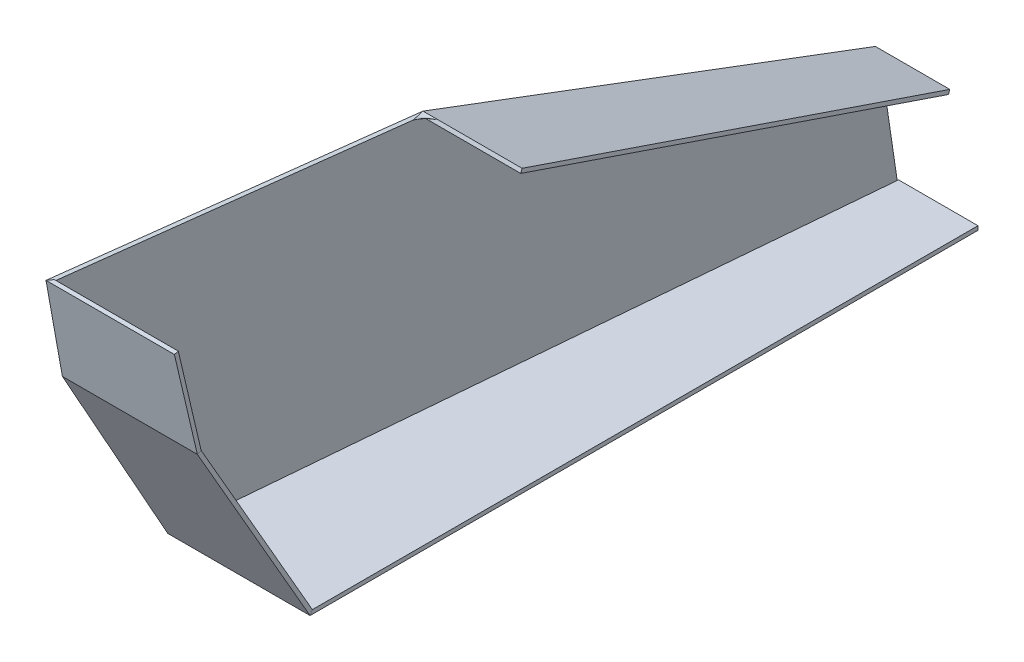
ISO-10303-21;
HEADER;
FILE_DESCRIPTION(('STEP AP214'),'2;1');
FILE_NAME('part.step','',(''),(''),'','','');
FILE_SCHEMA(('AUTOMOTIVE_DESIGN { 1 0 10303 214 1 1 1 1 }'));
ENDSEC;
DATA;
#1=APPLICATION_CONTEXT('core data for automotive mechanical design processes');
#2=APPLICATION_PROTOCOL_DEFINITION('international standard','automotive_design',2000,#1);
#3=PRODUCT_CONTEXT('',#1,'mechanical');
#4=PRODUCT('Part','Part','',(#3));
#5=PRODUCT_RELATED_PRODUCT_CATEGORY('part','',(#4));
#6=PRODUCT_DEFINITION_FORMATION('','',#4);
#7=PRODUCT_DEFINITION_CONTEXT('part definition',#1,'design');
#8=PRODUCT_DEFINITION('design','',#6,#7);
#9=PRODUCT_DEFINITION_SHAPE('','',#8);
#10=(LENGTH_UNIT() NAMED_UNIT(*) SI_UNIT(.MILLI.,.METRE.));
#11=(NAMED_UNIT(*) PLANE_ANGLE_UNIT() SI_UNIT($,.RADIAN.));
#12=(NAMED_UNIT(*) SI_UNIT($,.STERADIAN.) SOLID_ANGLE_UNIT());
#13=UNCERTAINTY_MEASURE_WITH_UNIT(LENGTH_MEASURE(1.E-05),#10,'distance_accuracy_value','');
#14=(GEOMETRIC_REPRESENTATION_CONTEXT(3) GLOBAL_UNCERTAINTY_ASSIGNED_CONTEXT((#13)) GLOBAL_UNIT_ASSIGNED_CONTEXT((#10,
#11,#12)) REPRESENTATION_CONTEXT('',''));
#15=CARTESIAN_POINT('',(0.,0.,0.));
#16=DIRECTION('',(0.,0.,1.));
#17=DIRECTION('',(1.,0.,0.));
#18=AXIS2_PLACEMENT_3D('',#15,#16,#17);
#19=CARTESIAN_POINT('',(0.,110.310015798724,40.4378275892309));
#20=DIRECTION('',(0.,0.946709580585224,-0.322088450628316));
#21=DIRECTION('',(0.,-0.322088450628316,-0.946709580585224));
#22=AXIS2_PLACEMENT_3D('',#19,#20,#21);
#23=PLANE('',#22);
#24=DIRECTION('',(-0.0545658529524883,0.321608594898021,0.945299148089793));
#25=VECTOR('',#24,1.);
#26=CARTESIAN_POINT('',(24.5252101587905,1.78945060946269,-278.534984241748));
#27=LINE('',#26,#25);
#28=CARTESIAN_POINT('',(24.5252101587905,1.78945060946267,-278.534984241748));
#29=VERTEX_POINT('',#28);
#30=CARTESIAN_POINT('',(6.11302436407989,110.310015798724,40.4378275892309));
#31=VERTEX_POINT('',#30);
#32=EDGE_CURVE('E134',#29,#31,#27,.T.);
#33=ORIENTED_EDGE('',*,*,#32,.T.);
#34=DIRECTION('',(1.,0.,0.));
#35=VECTOR('',#34,1.);
#36=CARTESIAN_POINT('',(11.7446754594523,110.310015798724,40.4378275892309));
#37=LINE('',#36,#35);
#38=CARTESIAN_POINT('',(17.3763265548247,110.310015798724,40.4378275892309));
#39=VERTEX_POINT('',#38);
#40=EDGE_CURVE('E113',#31,#39,#37,.T.);
#41=ORIENTED_EDGE('',*,*,#40,.T.);
#42=DIRECTION('',(1.,0.,0.));
#43=VECTOR('',#42,1.);
#44=CARTESIAN_POINT('',(48.6881632774124,110.310015798724,40.4378275892309));
#45=LINE('',#44,#43);
#46=CARTESIAN_POINT('',(80.,110.310015798724,40.4378275892308));
#47=VERTEX_POINT('',#46);
#48=EDGE_CURVE('E121',#39,#47,#45,.T.);
#49=ORIENTED_EDGE('',*,*,#48,.T.);
#50=DIRECTION('',(0.,-0.322088450628316,-0.946709580585224));
#51=VECTOR('',#50,1.);
#52=CARTESIAN_POINT('',(80.,56.0497332040935,-119.048578326258));
#53=LINE('',#52,#51);
#54=CARTESIAN_POINT('',(80.,1.78945060946263,-278.534984241748));
#55=VERTEX_POINT('',#54);
#56=EDGE_CURVE('E130',#47,#55,#53,.T.);
#57=ORIENTED_EDGE('',*,*,#56,.T.);
#58=DIRECTION('',(-1.,0.,0.));
#59=VECTOR('',#58,1.);
#60=CARTESIAN_POINT('',(52.2626050793952,1.78945060946263,-278.534984241748));
#61=LINE('',#60,#59);
#62=EDGE_CURVE('E259',#55,#29,#61,.T.);
#63=ORIENTED_EDGE('',*,*,#62,.T.);
#64=EDGE_LOOP('',(#33,#41,#49,#57,#63));
#65=FACE_BOUND('',#64,.T.);
#66=ADVANCED_FACE('F37',(#65),#23,.T.);
#67=CARTESIAN_POINT('',(0.,-99.7780619293242,-299.564386351645));
#68=DIRECTION('',(0.,-0.999999864234865,0.00052108564756985));
#69=DIRECTION('',(0.,0.00052108564756985,0.999999864234865));
#70=AXIS2_PLACEMENT_3D('',#67,#68,#69);
#71=PLANE('',#70);
#72=DIRECTION('',(0.087110660113036,-0.000519104814101098,-0.996198506034246));
#73=VECTOR('',#72,1.);
#74=CARTESIAN_POINT('',(-4.29862651379476,-99.6482857257989,-50.5147598430838));
#75=LINE('',#74,#73);
#76=CARTESIAN_POINT('',(-26.0762915420538,-99.5185095222735,198.534866665478));
#77=VERTEX_POINT('',#76);
#78=CARTESIAN_POINT('',(17.4790385144642,-99.7780619293242,-299.564386351645));
#79=VERTEX_POINT('',#78);
#80=EDGE_CURVE('E274',#77,#79,#75,.T.);
#81=ORIENTED_EDGE('',*,*,#80,.T.);
#82=DIRECTION('',(1.,0.,0.));
#83=VECTOR('',#82,1.);
#84=CARTESIAN_POINT('',(17.9677659140272,-99.7780619293242,-299.564386351645));
#85=LINE('',#84,#83);
#86=CARTESIAN_POINT('',(18.4564933135901,-99.7780619293242,-299.564386351645));
#87=VERTEX_POINT('',#86);
#88=EDGE_CURVE('E230',#79,#87,#85,.T.);
#89=ORIENTED_EDGE('',*,*,#88,.T.);
#90=DIRECTION('',(1.,0.,0.));
#91=VECTOR('',#90,1.);
#92=CARTESIAN_POINT('',(49.2282466567951,-99.7780619293242,-299.564386351645));
#93=LINE('',#92,#91);
#94=CARTESIAN_POINT('',(80.,-99.7780619293242,-299.564386351645));
#95=VERTEX_POINT('',#94);
#96=EDGE_CURVE('E220',#87,#95,#93,.T.);
#97=ORIENTED_EDGE('',*,*,#96,.T.);
#98=DIRECTION('',(0.,0.000521085647569877,0.999999864234865));
#99=VECTOR('',#98,1.);
#100=CARTESIAN_POINT('',(80.,-99.6482857257989,-50.5147598430839));
#101=LINE('',#100,#99);
#102=CARTESIAN_POINT('',(80.,-99.5185095222736,198.534866665478));
#103=VERTEX_POINT('',#102);
#104=EDGE_CURVE('E210',#95,#103,#101,.T.);
#105=ORIENTED_EDGE('',*,*,#104,.T.);
#106=DIRECTION('',(-1.,0.,0.));
#107=VECTOR('',#106,1.);
#108=CARTESIAN_POINT('',(40.,-99.5185095222735,198.534866665478));
#109=LINE('',#108,#107);
#110=EDGE_CURVE('E277',#103,#77,#109,.T.);
#111=ORIENTED_EDGE('',*,*,#110,.T.);
#112=EDGE_LOOP('',(#81,#89,#97,#105,#111));
#113=FACE_BOUND('',#112,.T.);
#114=ADVANCED_FACE('F308',(#113),#71,.T.);
#115=CARTESIAN_POINT('',(0.,0.,0.));
#116=DIRECTION('',(0.992432509138968,-0.0868265938642405,0.086826593864241));
#117=DIRECTION('',(-0.0871557427476515,0.,0.996194698091746));
#118=AXIS2_PLACEMENT_3D('',#115,#116,#117);
#119=PLANE('',#118);
#120=DIRECTION('',(0.0839663559491868,-0.0360755085509896,-0.995815348722544));
#121=VECTOR('',#120,1.);
#122=CARTESIAN_POINT('',(-4.76922205797275,114.985490510171,169.497948076286));
#123=LINE('',#122,#121);
#124=CARTESIAN_POINT('',(-15.6514684800254,119.660965221617,298.558068563341));
#125=VERTEX_POINT('',#124);
#126=EDGE_CURVE('E136',#125,#31,#123,.T.);
#127=ORIENTED_EDGE('',*,*,#126,.T.);
#128=ORIENTED_EDGE('',*,*,#32,.F.);
#129=DIRECTION('',(-0.0677772099004537,-0.97697912623965,-0.202282072142146));
#130=VECTOR('',#129,1.);
#131=CARTESIAN_POINT('',(24.4749597784683,1.06511314068204,-278.684957235213));
#132=LINE('',#131,#130);
#133=CARTESIAN_POINT('',(24.4247093981462,0.340775671901398,-278.834930228678));
#134=VERTEX_POINT('',#133);
#135=EDGE_CURVE('E250',#29,#134,#132,.T.);
#136=ORIENTED_EDGE('',*,*,#135,.T.);
#137=DIRECTION('',(-0.0677772099004547,-0.976979126239648,-0.202282072142153));
#138=VECTOR('',#137,1.);
#139=CARTESIAN_POINT('',(20.9518739563052,-49.7186431287114,-289.199658290162));
#140=LINE('',#139,#138);
#141=EDGE_CURVE('E240',#134,#79,#140,.T.);
#142=ORIENTED_EDGE('',*,*,#141,.T.);
#143=ORIENTED_EDGE('',*,*,#80,.F.);
#144=DIRECTION('',(-0.0322106718301427,-0.866429327691845,-0.498259663966198));
#145=VECTOR('',#144,1.);
#146=CARTESIAN_POINT('',(-26.0492366756166,-98.7907653180672,198.953372331262));
#147=LINE('',#146,#145);
#148=CARTESIAN_POINT('',(-20.6427459229518,46.6375005903725,282.585166162343));
#149=VERTEX_POINT('',#148);
#150=EDGE_CURVE('E137',#149,#77,#147,.T.);
#151=ORIENTED_EDGE('',*,*,#150,.F.);
#152=DIRECTION('',(-0.0650839922381132,-0.971565120847082,-0.227651685492871));
#153=VECTOR('',#152,1.);
#154=CARTESIAN_POINT('',(-20.555304777843,47.9428102954658,282.891019005429));
#155=LINE('',#154,#153);
#156=CARTESIAN_POINT('',(-15.7482066105749,119.702528026343,299.70535325992));
#157=VERTEX_POINT('',#156);
#158=EDGE_CURVE('E146',#157,#149,#155,.T.);
#159=ORIENTED_EDGE('',*,*,#158,.F.);
#160=DIRECTION('',(0.0839663559491908,-0.0360755085509986,-0.995815348722543));
#161=VECTOR('',#160,1.);
#162=CARTESIAN_POINT('',(-15.6998375453002,119.68174662398,299.13171091163));
#163=LINE('',#162,#161);
#164=EDGE_CURVE('E144',#157,#125,#163,.T.);
#165=ORIENTED_EDGE('',*,*,#164,.T.);
#166=EDGE_LOOP('',(#127,#128,#136,#142,#143,#151,#159,#165));
#167=FACE_BOUND('',#166,.T.);
#168=ADVANCED_FACE('F303',(#167),#119,.F.);
#169=CARTESIAN_POINT('',(0.,-99.5185095222735,198.534866665478));
#170=DIRECTION('',(0.,-0.49851834429635,0.866879149824257));
#171=DIRECTION('',(0.,0.866879149824257,0.49851834429635));
#172=AXIS2_PLACEMENT_3D('',#169,#170,#171);
#173=PLANE('',#172);
#174=ORIENTED_EDGE('',*,*,#150,.T.);
#175=ORIENTED_EDGE('',*,*,#110,.F.);
#176=DIRECTION('',(0.,0.866879149824257,0.498518344296349));
#177=VECTOR('',#176,1.);
#178=CARTESIAN_POINT('',(80.,-26.4405044659506,240.56001641391));
#179=LINE('',#178,#177);
#180=CARTESIAN_POINT('',(80.,46.6375005903725,282.585166162343));
#181=VERTEX_POINT('',#180);
#182=EDGE_CURVE('E200',#103,#181,#179,.T.);
#183=ORIENTED_EDGE('',*,*,#182,.T.);
#184=DIRECTION('',(-1.,0.,0.));
#185=VECTOR('',#184,1.);
#186=CARTESIAN_POINT('',(40.,46.6375005903725,282.585166162343));
#187=LINE('',#186,#185);
#188=EDGE_CURVE('E286',#181,#149,#187,.T.);
#189=ORIENTED_EDGE('',*,*,#188,.T.);
#190=EDGE_LOOP('',(#174,#175,#183,#189));
#191=FACE_BOUND('',#190,.T.);
#192=ADVANCED_FACE('F306',(#191),#173,.T.);
#193=CARTESIAN_POINT('',(0.,46.6375005903725,282.585166162343));
#194=DIRECTION('',(0.,-0.228135380560819,0.973629420332177));
#195=DIRECTION('',(0.,0.973629420332177,0.228135380560819));
#196=AXIS2_PLACEMENT_3D('',#193,#194,#195);
#197=PLANE('',#196);
#198=ORIENTED_EDGE('',*,*,#158,.T.);
#199=ORIENTED_EDGE('',*,*,#188,.F.);
#200=DIRECTION('',(0.,0.973629420332176,0.22813538056082));
#201=VECTOR('',#200,1.);
#202=CARTESIAN_POINT('',(80.,83.1700143083578,291.145259711131));
#203=LINE('',#202,#201);
#204=CARTESIAN_POINT('',(80.,119.702528026343,299.70535325992));
#205=VERTEX_POINT('',#204);
#206=EDGE_CURVE('E190',#181,#205,#203,.T.);
#207=ORIENTED_EDGE('',*,*,#206,.T.);
#208=DIRECTION('',(-1.,0.,0.));
#209=VECTOR('',#208,1.);
#210=CARTESIAN_POINT('',(32.1258966947125,119.702528026343,299.70535325992));
#211=LINE('',#210,#209);
#212=EDGE_CURVE('E180',#205,#157,#211,.T.);
#213=ORIENTED_EDGE('',*,*,#212,.T.);
#214=EDGE_LOOP('',(#198,#199,#207,#213));
#215=FACE_BOUND('',#214,.T.);
#216=ADVANCED_FACE('F299',(#215),#197,.T.);
#217=CARTESIAN_POINT('',(8.30819276683167,110.385571868704,49.9741200248322));
#218=CARTESIAN_POINT('',(6.11302436407989,110.310015798724,40.4378275892309));
#219=CARTESIAN_POINT('',(8.80288361532537,107.469887056969,41.4040929411158));
#220=CARTESIAN_POINT('',(17.3763265548247,110.310015798724,40.4378275892309));
#221=B_SPLINE_SURFACE_WITH_KNOTS('',1,1,((#217,#218),(#219,#220)),.UNSPECIFIED.,.F.,.F.,.F.,(2,
2),(2,2),(0.,1.),(0.,1.),.UNSPECIFIED.);
#222=DIRECTION('',(-0.0545658529524883,0.321608594898021,0.945299148089793));
#223=VECTOR('',#222,1.);
#224=CARTESIAN_POINT('',(8.77667362524173,107.624367517311,41.8581549589694));
#225=LINE('',#224,#223);
#226=CARTESIAN_POINT('',(8.80288361532537,107.469887056969,41.4040929411158));
#227=VERTEX_POINT('',#226);
#228=CARTESIAN_POINT('',(8.30819276683167,110.385571868704,49.9741200248322));
#229=VERTEX_POINT('',#228);
#230=EDGE_CURVE('E117',#227,#229,#225,.T.);
#231=DIRECTION('',(0.943882555833576,0.312680447584724,-0.10637978422282));
#232=VECTOR('',#231,1.);
#233=CARTESIAN_POINT('',(13.089605085075,108.889951427847,40.9209602651733));
#234=LINE('',#233,#232);
#235=EDGE_CURVE('E108',#227,#39,#234,.T.);
#236=DIRECTION('',(-0.224317755475283,-0.00772085094208945,-0.97448547092261));
#237=VECTOR('',#236,1.);
#238=CARTESIAN_POINT('',(7.21060856545578,110.347793833714,45.2059738070315));
#239=LINE('',#238,#237);
#240=EDGE_CURVE('E120',#229,#31,#239,.T.);
#241=ORIENTED_EDGE('',*,*,#230,.F.);
#242=ORIENTED_EDGE('',*,*,#235,.T.);
#243=ORIENTED_EDGE('',*,*,#40,.F.);
#244=ORIENTED_EDGE('',*,*,#240,.F.);
#245=EDGE_LOOP('',(#241,#242,#243,#244));
#246=FACE_BOUND('',#245,.T.);
#247=ADVANCED_FACE('F110',(#246),#221,.T.);
#248=CARTESIAN_POINT('',(-12.4815339952419,119.317720431062,296.533932837826));
#249=DIRECTION('',(-0.0895955683767089,-0.995570037858072,0.0285119947834629));
#250=DIRECTION('',(0.0839663559491868,-0.0360755085509896,-0.995815348722544));
#251=AXIS2_PLACEMENT_3D('',#248,#249,#250);
#252=PLANE('',#251);
#253=DIRECTION('',(-0.0839663559491868,0.0360755085509896,0.995815348722544));
#254=VECTOR('',#253,1.);
#255=CARTESIAN_POINT('',(9.09032189149679,110.049536017132,40.6983073708237));
#256=LINE('',#255,#254);
#257=CARTESIAN_POINT('',(-12.4815339952419,119.317720431062,296.533932837826));
#258=VERTEX_POINT('',#257);
#259=EDGE_CURVE('E387',#229,#258,#256,.T.);
#260=ORIENTED_EDGE('',*,*,#259,.F.);
#261=ORIENTED_EDGE('',*,*,#240,.T.);
#262=ORIENTED_EDGE('',*,*,#126,.F.);
#263=DIRECTION('',(-0.839340817729522,0.0908849582126281,0.535954210790275));
#264=VECTOR('',#263,1.);
#265=CARTESIAN_POINT('',(-14.0665012376337,119.48934282634,297.546000700584));
#266=LINE('',#265,#264);
#267=EDGE_CURVE('E156',#258,#125,#266,.T.);
#268=ORIENTED_EDGE('',*,*,#267,.F.);
#269=EDGE_LOOP('',(#260,#261,#262,#268));
#270=FACE_BOUND('',#269,.T.);
#271=ADVANCED_FACE('F466',(#270),#252,.F.);
#272=CARTESIAN_POINT('',(-12.409908638316,120.386934168026,296.784464998923));
#273=CARTESIAN_POINT('',(-15.7482066105749,119.702528026343,299.70535325992));
#274=CARTESIAN_POINT('',(-12.4815339952419,119.317720431062,296.533932837826));
#275=CARTESIAN_POINT('',(-15.6514684800254,119.660965221617,298.558068563341));
#276=B_SPLINE_SURFACE_WITH_KNOTS('',1,1,((#272,#273),(#274,#275)),.UNSPECIFIED.,.F.,.F.,.F.,(2,
2),(2,2),(0.,1.),(0.,1.),.UNSPECIFIED.);
#277=DIRECTION('',(-0.0650839922381132,-0.971565120847082,-0.227651685492871));
#278=VECTOR('',#277,1.);
#279=CARTESIAN_POINT('',(-17.231147588913,48.4161247171829,279.920668917518));
#280=LINE('',#279,#278);
#281=CARTESIAN_POINT('',(-12.409908638316,120.386934168025,296.784464998923));
#282=VERTEX_POINT('',#281);
#283=EDGE_CURVE('E346',#282,#258,#280,.T.);
#284=DIRECTION('',(-0.743788958182735,-0.152489003476044,0.650788052674851));
#285=VECTOR('',#284,1.);
#286=CARTESIAN_POINT('',(-14.0790576244455,120.044731097184,298.244909129421));
#287=LINE('',#286,#285);
#288=EDGE_CURVE('E163',#282,#157,#287,.T.);
#289=ORIENTED_EDGE('',*,*,#283,.T.);
#290=ORIENTED_EDGE('',*,*,#267,.T.);
#291=ORIENTED_EDGE('',*,*,#164,.F.);
#292=ORIENTED_EDGE('',*,*,#288,.F.);
#293=EDGE_LOOP('',(#289,#290,#291,#292));
#294=FACE_BOUND('',#293,.T.);
#295=ADVANCED_FACE('F344',(#294),#276,.T.);
#296=CARTESIAN_POINT('',(80.,120.386934168025,296.784464998923));
#297=DIRECTION('',(0.,-0.973629420332177,-0.228135380560816));
#298=DIRECTION('',(-1.,0.,0.));
#299=AXIS2_PLACEMENT_3D('',#296,#297,#298);
#300=PLANE('',#299);
#301=DIRECTION('',(1.,0.,0.));
#302=VECTOR('',#301,1.);
#303=CARTESIAN_POINT('',(0.,120.386934168025,296.784464998923));
#304=LINE('',#303,#302);
#305=CARTESIAN_POINT('',(80.,120.386934168025,296.784464998923));
#306=VERTEX_POINT('',#305);
#307=EDGE_CURVE('E342',#282,#306,#304,.T.);
#308=ORIENTED_EDGE('',*,*,#307,.F.);
#309=ORIENTED_EDGE('',*,*,#288,.T.);
#310=ORIENTED_EDGE('',*,*,#212,.F.);
#311=DIRECTION('',(0.,-0.228135380560816,0.973629420332177));
#312=VECTOR('',#311,1.);
#313=CARTESIAN_POINT('',(80.,120.044731097184,298.244909129421));
#314=LINE('',#313,#312);
#315=EDGE_CURVE('E169',#306,#205,#314,.T.);
#316=ORIENTED_EDGE('',*,*,#315,.F.);
#317=EDGE_LOOP('',(#308,#309,#310,#316));
#318=FACE_BOUND('',#317,.T.);
#319=ADVANCED_FACE('F339',(#318),#300,.F.);
#320=CARTESIAN_POINT('',(80.,47.7510046659383,279.764821720586));
#321=DIRECTION('',(-1.,0.,0.));
#322=DIRECTION('',(0.,0.973629420332177,0.228135380560819));
#323=AXIS2_PLACEMENT_3D('',#320,#321,#322);
#324=PLANE('',#323);
#325=DIRECTION('',(0.,0.973629420332177,0.228135380560819));
#326=VECTOR('',#325,1.);
#327=CARTESIAN_POINT('',(80.,47.321906732055,279.664277901347));
#328=LINE('',#327,#326);
#329=CARTESIAN_POINT('',(80.,47.7510046659383,279.764821720586));
#330=VERTEX_POINT('',#329);
#331=EDGE_CURVE('E335',#306,#330,#328,.F.);
#332=ORIENTED_EDGE('',*,*,#331,.F.);
#333=ORIENTED_EDGE('',*,*,#315,.T.);
#334=ORIENTED_EDGE('',*,*,#206,.F.);
#335=DIRECTION('',(0.,-0.367226515962012,0.930131542296251));
#336=VECTOR('',#335,1.);
#337=CARTESIAN_POINT('',(80.,47.1942526281554,281.174993941465));
#338=LINE('',#337,#336);
#339=EDGE_CURVE('E184',#330,#181,#338,.T.);
#340=ORIENTED_EDGE('',*,*,#339,.F.);
#341=EDGE_LOOP('',(#332,#333,#334,#340));
#342=FACE_BOUND('',#341,.T.);
#343=ADVANCED_FACE('F332',(#342),#324,.F.);
#344=CARTESIAN_POINT('',(80.,-96.5194137158899,196.798874140429));
#345=DIRECTION('',(-1.,0.,0.));
#346=DIRECTION('',(0.,0.866879149824257,0.49851834429635));
#347=AXIS2_PLACEMENT_3D('',#344,#345,#346);
#348=PLANE('',#347);
#349=DIRECTION('',(0.,0.866879149824257,0.49851834429635));
#350=VECTOR('',#349,1.);
#351=CARTESIAN_POINT('',(80.,-98.0229544893845,195.934229216005));
#352=LINE('',#351,#350);
#353=CARTESIAN_POINT('',(80.,-96.51941371589,196.798874140429));
#354=VERTEX_POINT('',#353);
#355=EDGE_CURVE('E328',#330,#354,#352,.F.);
#356=ORIENTED_EDGE('',*,*,#355,.F.);
#357=ORIENTED_EDGE('',*,*,#339,.T.);
#358=ORIENTED_EDGE('',*,*,#182,.F.);
#359=DIRECTION('',(0.,-0.865467087280574,0.500965788087451));
#360=VECTOR('',#359,1.);
#361=CARTESIAN_POINT('',(80.,-98.0189616190818,197.666870402953));
#362=LINE('',#361,#360);
#363=EDGE_CURVE('E194',#354,#103,#362,.T.);
#364=ORIENTED_EDGE('',*,*,#363,.F.);
#365=EDGE_LOOP('',(#356,#357,#358,#364));
#366=FACE_BOUND('',#365,.T.);
#367=ADVANCED_FACE('F324',(#366),#348,.F.);
#368=CARTESIAN_POINT('',(80.,-96.7780623366196,-299.565949608588));
#369=DIRECTION('',(-1.,0.,0.));
#370=DIRECTION('',(0.,0.00052108564756986,0.999999864234865));
#371=AXIS2_PLACEMENT_3D('',#368,#369,#370);
#372=PLANE('',#371);
#373=DIRECTION('',(0.,0.00052108564756985,0.999999864234865));
#374=VECTOR('',#373,1.);
#375=CARTESIAN_POINT('',(80.,-96.7780623366196,-299.565949608588));
#376=LINE('',#375,#374);
#377=CARTESIAN_POINT('',(80.,-96.7780623366196,-299.565949608588));
#378=VERTEX_POINT('',#377);
#379=EDGE_CURVE('E320',#354,#378,#376,.F.);
#380=ORIENTED_EDGE('',*,*,#379,.F.);
#381=ORIENTED_EDGE('',*,*,#363,.T.);
#382=ORIENTED_EDGE('',*,*,#104,.F.);
#383=DIRECTION('',(0.,-0.999999864234865,0.000521085647575689));
#384=VECTOR('',#383,1.);
#385=CARTESIAN_POINT('',(80.,-98.2780621329719,-299.565167980117));
#386=LINE('',#385,#384);
#387=EDGE_CURVE('E204',#378,#95,#386,.T.);
#388=ORIENTED_EDGE('',*,*,#387,.F.);
#389=EDGE_LOOP('',(#380,#381,#382,#388));
#390=FACE_BOUND('',#389,.T.);
#391=ADVANCED_FACE('F314',(#390),#372,.F.);
#392=CARTESIAN_POINT('',(20.76451682002,-96.7780623366196,-299.565949608588));
#393=DIRECTION('',(0.,0.000521085647575692,0.999999864234865));
#394=DIRECTION('',(1.,0.,0.));
#395=AXIS2_PLACEMENT_3D('',#392,#393,#394);
#396=PLANE('',#395);
#397=DIRECTION('',(1.,0.,0.));
#398=VECTOR('',#397,1.);
#399=CARTESIAN_POINT('',(0.,-96.7780623366196,-299.565949608588));
#400=LINE('',#399,#398);
#401=CARTESIAN_POINT('',(20.76451682002,-96.7780623366196,-299.565949608588));
#402=VERTEX_POINT('',#401);
#403=EDGE_CURVE('E393',#378,#402,#400,.F.);
#404=ORIENTED_EDGE('',*,*,#403,.F.);
#405=ORIENTED_EDGE('',*,*,#387,.T.);
#406=ORIENTED_EDGE('',*,*,#96,.F.);
#407=DIRECTION('',(-0.609765731933374,-0.792581593016341,0.000413002948724894));
#408=VECTOR('',#407,1.);
#409=CARTESIAN_POINT('',(19.610505066805,-98.2780621329719,-299.565167980117));
#410=LINE('',#409,#408);
#411=EDGE_CURVE('E214',#402,#87,#410,.T.);
#412=ORIENTED_EDGE('',*,*,#411,.F.);
#413=EDGE_LOOP('',(#404,#405,#406,#412));
#414=FACE_BOUND('',#413,.T.);
#415=ADVANCED_FACE('F585',(#414),#396,.F.);
#416=CARTESIAN_POINT('',(20.6825632861847,-96.7775739638545,-298.628728057689));
#417=CARTESIAN_POINT('',(17.4790385144642,-99.7780619293242,-299.564386351645));
#418=CARTESIAN_POINT('',(20.76451682002,-96.7780623366196,-299.565949608588));
#419=CARTESIAN_POINT('',(18.4564933135901,-99.7780619293242,-299.564386351645));
#420=B_SPLINE_SURFACE_WITH_KNOTS('',1,1,((#416,#417),(#418,#419)),.UNSPECIFIED.,.F.,.F.,.F.,(2,
2),(2,2),(0.,1.),(0.,1.),.UNSPECIFIED.);
#421=DIRECTION('',(0.087110660113036,-0.000519104814101307,-0.996198506034246));
#422=VECTOR('',#421,1.);
#423=CARTESIAN_POINT('',(20.6069501200766,-96.7771233742426,-297.764015024684));
#424=LINE('',#423,#422);
#425=CARTESIAN_POINT('',(20.6825632861847,-96.7775739638545,-298.628728057689));
#426=VERTEX_POINT('',#425);
#427=EDGE_CURVE('E11',#426,#402,#424,.T.);
#428=DIRECTION('',(-0.713818915757634,-0.668577650830887,-0.208486163368335));
#429=VECTOR('',#428,1.);
#430=CARTESIAN_POINT('',(19.0808009003245,-98.2778179465894,-299.096557204667));
#431=LINE('',#430,#429);
#432=EDGE_CURVE('E224',#426,#79,#431,.T.);
#433=ORIENTED_EDGE('',*,*,#427,.T.);
#434=ORIENTED_EDGE('',*,*,#411,.T.);
#435=ORIENTED_EDGE('',*,*,#88,.F.);
#436=ORIENTED_EDGE('',*,*,#432,.F.);
#437=EDGE_LOOP('',(#433,#434,#435,#436));
#438=FACE_BOUND('',#437,.T.);
#439=ADVANCED_FACE('F594',(#438),#420,.T.);
#440=CARTESIAN_POINT('',(27.2920641529913,-1.50448155983134,-278.902576256418));
#441=DIRECTION('',(-0.102391233131742,-0.194866440132589,0.97547070990769));
#442=DIRECTION('',(-0.0677772099004546,-0.976979126239648,-0.202282072142153));
#443=AXIS2_PLACEMENT_3D('',#440,#441,#442);
#444=PLANE('',#443);
#445=DIRECTION('',(0.0677772099004547,0.976979126239648,0.202282072142153));
#446=VECTOR('',#445,1.);
#447=CARTESIAN_POINT('',(25.0643002533384,-33.616733323333,-285.551370128682));
#448=LINE('',#447,#446);
#449=CARTESIAN_POINT('',(27.2920641529913,-1.50448155983133,-278.902576256418));
#450=VERTEX_POINT('',#449);
#451=EDGE_CURVE('E394',#426,#450,#448,.T.);
#452=ORIENTED_EDGE('',*,*,#451,.F.);
#453=ORIENTED_EDGE('',*,*,#432,.T.);
#454=ORIENTED_EDGE('',*,*,#141,.F.);
#455=DIRECTION('',(-0.84075177638882,0.541057325694415,0.0198348383268284));
#456=VECTOR('',#455,1.);
#457=CARTESIAN_POINT('',(25.8583867755687,-0.581852943964969,-278.868753242548));
#458=LINE('',#457,#456);
#459=EDGE_CURVE('E234',#450,#134,#458,.T.);
#460=ORIENTED_EDGE('',*,*,#459,.F.);
#461=EDGE_LOOP('',(#452,#453,#454,#460));
#462=FACE_BOUND('',#461,.T.);
#463=ADVANCED_FACE('F604',(#462),#444,.F.);
#464=CARTESIAN_POINT('',(27.215069410036,-1.05067813229309,-277.568718889863));
#465=CARTESIAN_POINT('',(24.5252101587905,1.78945060946269,-278.534984241748));
#466=CARTESIAN_POINT('',(27.2920641529913,-1.50448155983134,-278.902576256418));
#467=CARTESIAN_POINT('',(24.4247093981462,0.340775671901397,-278.834930228678));
#468=B_SPLINE_SURFACE_WITH_KNOTS('',1,1,((#464,#465),(#466,#467)),.UNSPECIFIED.,.F.,.F.,.F.,(2,
2),(2,2),(0.,1.),(0.,1.),.UNSPECIFIED.);
#469=DIRECTION('',(-0.0545658529524883,0.321608594898021,0.945299148089793));
#470=VECTOR('',#469,1.);
#471=CARTESIAN_POINT('',(8.77667362524173,107.624367517311,41.8581549589694));
#472=LINE('',#471,#470);
#473=CARTESIAN_POINT('',(27.215069410036,-1.05067813229309,-277.568718889863));
#474=VERTEX_POINT('',#473);
#475=EDGE_CURVE('E47',#450,#474,#472,.T.);
#476=DIRECTION('',(-0.66757309401913,0.704867189860829,-0.239809109083502));
#477=VECTOR('',#476,1.);
#478=CARTESIAN_POINT('',(25.8701397844132,0.369386238584797,-278.051851565805));
#479=LINE('',#478,#477);
#480=EDGE_CURVE('E244',#474,#29,#479,.T.);
#481=ORIENTED_EDGE('',*,*,#475,.F.);
#482=ORIENTED_EDGE('',*,*,#459,.T.);
#483=ORIENTED_EDGE('',*,*,#135,.F.);
#484=ORIENTED_EDGE('',*,*,#480,.F.);
#485=EDGE_LOOP('',(#481,#482,#483,#484));
#486=FACE_BOUND('',#485,.T.);
#487=ADVANCED_FACE('F463',(#486),#468,.T.);
#488=CARTESIAN_POINT('',(80.0000000000001,-1.05067813229306,-277.568718889863));
#489=DIRECTION('',(0.,0.322088450628292,0.946709580585232));
#490=DIRECTION('',(-1.,0.,0.));
#491=AXIS2_PLACEMENT_3D('',#488,#489,#490);
#492=PLANE('',#491);
#493=DIRECTION('',(1.,0.,0.));
#494=VECTOR('',#493,1.);
#495=CARTESIAN_POINT('',(0.,-1.05067813229306,-277.568718889863));
#496=LINE('',#495,#494);
#497=CARTESIAN_POINT('',(80.0000000000001,-1.05067813229306,-277.568718889863));
#498=VERTEX_POINT('',#497);
#499=EDGE_CURVE('E384',#474,#498,#496,.T.);
#500=ORIENTED_EDGE('',*,*,#499,.F.);
#501=ORIENTED_EDGE('',*,*,#480,.T.);
#502=ORIENTED_EDGE('',*,*,#62,.F.);
#503=DIRECTION('',(0.,0.946709580585232,-0.322088450628292));
#504=VECTOR('',#503,1.);
#505=CARTESIAN_POINT('',(80.,0.369386238584783,-278.051851565805));
#506=LINE('',#505,#504);
#507=EDGE_CURVE('E253',#498,#55,#506,.T.);
#508=ORIENTED_EDGE('',*,*,#507,.F.);
#509=EDGE_LOOP('',(#500,#501,#502,#508));
#510=FACE_BOUND('',#509,.T.);
#511=ADVANCED_FACE('F459',(#510),#492,.F.);
#512=CARTESIAN_POINT('',(80.,107.469887056969,41.4040929411158));
#513=DIRECTION('',(-1.,0.,0.));
#514=DIRECTION('',(0.,-0.322088450628316,-0.946709580585224));
#515=AXIS2_PLACEMENT_3D('',#512,#513,#514);
#516=PLANE('',#515);
#517=DIRECTION('',(0.,-0.322088450628316,-0.946709580585224));
#518=VECTOR('',#517,1.);
#519=CARTESIAN_POINT('',(80.,107.469887056969,41.4040929411158));
#520=LINE('',#519,#518);
#521=CARTESIAN_POINT('',(80.,107.469887056969,41.4040929411158));
#522=VERTEX_POINT('',#521);
#523=EDGE_CURVE('E374',#498,#522,#520,.F.);
#524=ORIENTED_EDGE('',*,*,#523,.F.);
#525=ORIENTED_EDGE('',*,*,#507,.T.);
#526=ORIENTED_EDGE('',*,*,#56,.F.);
#527=DIRECTION('',(0.,0.946709580585216,-0.322088450628339));
#528=VECTOR('',#527,1.);
#529=CARTESIAN_POINT('',(80.,108.889951427846,40.9209602651733));
#530=LINE('',#529,#528);
#531=EDGE_CURVE('E125',#522,#47,#530,.T.);
#532=ORIENTED_EDGE('',*,*,#531,.F.);
#533=EDGE_LOOP('',(#524,#525,#526,#532));
#534=FACE_BOUND('',#533,.T.);
#535=ADVANCED_FACE('F630',(#534),#516,.F.);
#536=CARTESIAN_POINT('',(8.80288361532537,107.469887056969,41.4040929411158));
#537=DIRECTION('',(0.,-0.322088450628318,-0.946709580585223));
#538=DIRECTION('',(1.,0.,0.));
#539=AXIS2_PLACEMENT_3D('',#536,#537,#538);
#540=PLANE('',#539);
#541=DIRECTION('',(1.,0.,0.));
#542=VECTOR('',#541,1.);
#543=CARTESIAN_POINT('',(0.,107.469887056969,41.4040929411158));
#544=LINE('',#543,#542);
#545=EDGE_CURVE('E371',#522,#227,#544,.F.);
#546=ORIENTED_EDGE('',*,*,#545,.F.);
#547=ORIENTED_EDGE('',*,*,#531,.T.);
#548=ORIENTED_EDGE('',*,*,#48,.F.);
#549=ORIENTED_EDGE('',*,*,#235,.F.);
#550=EDGE_LOOP('',(#546,#547,#548,#549));
#551=FACE_BOUND('',#550,.T.);
#552=ADVANCED_FACE('F123',(#551),#540,.F.);
#553=CARTESIAN_POINT('',(0.,107.469887056969,41.4040929411158));
#554=DIRECTION('',(0.,0.946709580585224,-0.322088450628316));
#555=DIRECTION('',(0.,-0.322088450628316,-0.946709580585224));
#556=AXIS2_PLACEMENT_3D('',#553,#554,#555);
#557=PLANE('',#556);
#558=DIRECTION('',(-0.0545658529524883,0.321608594898021,0.945299148089793));
#559=VECTOR('',#558,1.);
#560=CARTESIAN_POINT('',(8.77667362524173,107.624367517311,41.8581549589694));
#561=LINE('',#560,#559);
#562=EDGE_CURVE('E399',#474,#227,#561,.T.);
#563=ORIENTED_EDGE('',*,*,#562,.F.);
#564=ORIENTED_EDGE('',*,*,#499,.T.);
#565=ORIENTED_EDGE('',*,*,#523,.T.);
#566=ORIENTED_EDGE('',*,*,#545,.T.);
#567=EDGE_LOOP('',(#563,#564,#565,#566));
#568=FACE_BOUND('',#567,.T.);
#569=ADVANCED_FACE('F455',(#568),#557,.F.);
#570=CARTESIAN_POINT('',(0.,-96.7780623366196,-299.565949608588));
#571=DIRECTION('',(0.,-0.999999864234865,0.00052108564756985));
#572=DIRECTION('',(0.,0.00052108564756985,0.999999864234865));
#573=AXIS2_PLACEMENT_3D('',#570,#571,#572);
#574=PLANE('',#573);
#575=DIRECTION('',(0.087110660113036,-0.000519104814101307,-0.996198506034246));
#576=VECTOR('',#575,1.);
#577=CARTESIAN_POINT('',(20.6069501200766,-96.7771233742426,-297.764015024684));
#578=LINE('',#577,#576);
#579=CARTESIAN_POINT('',(-22.6391494089085,-96.51941371589,196.798874140429));
#580=VERTEX_POINT('',#579);
#581=EDGE_CURVE('E398',#580,#426,#578,.T.);
#582=ORIENTED_EDGE('',*,*,#581,.F.);
#583=DIRECTION('',(-1.,0.,0.));
#584=VECTOR('',#583,1.);
#585=CARTESIAN_POINT('',(0.,-96.51941371589,196.798874140429));
#586=LINE('',#585,#584);
#587=EDGE_CURVE('E405',#354,#580,#586,.T.);
#588=ORIENTED_EDGE('',*,*,#587,.F.);
#589=ORIENTED_EDGE('',*,*,#379,.T.);
#590=ORIENTED_EDGE('',*,*,#403,.T.);
#591=ORIENTED_EDGE('',*,*,#427,.F.);
#592=EDGE_LOOP('',(#582,#588,#589,#590,#591));
#593=FACE_BOUND('',#592,.T.);
#594=ADVANCED_FACE('F657',(#593),#574,.F.);
#595=CARTESIAN_POINT('',(2.97729752741691,-0.260479781592722,0.260479781592723));
#596=DIRECTION('',(0.992432509138968,-0.0868265938642405,0.086826593864241));
#597=DIRECTION('',(-0.0871557427476515,0.,0.996194698091746));
#598=AXIS2_PLACEMENT_3D('',#595,#596,#597);
#599=PLANE('',#598);
#600=ORIENTED_EDGE('',*,*,#259,.T.);
#601=DIRECTION('',(-0.0650839922381132,-0.971565120847082,-0.227651685492871));
#602=VECTOR('',#601,1.);
#603=CARTESIAN_POINT('',(-17.231147588913,48.4161247171829,279.920668917518));
#604=LINE('',#603,#602);
#605=CARTESIAN_POINT('',(-17.2757031903068,47.7510046659383,279.764821720586));
#606=VERTEX_POINT('',#605);
#607=EDGE_CURVE('E354',#258,#606,#604,.T.);
#608=ORIENTED_EDGE('',*,*,#607,.T.);
#609=DIRECTION('',(-0.0322106718301427,-0.866429327691845,-0.498259663966198));
#610=VECTOR('',#609,1.);
#611=CARTESIAN_POINT('',(-22.6714988217302,-97.3895750136769,196.298468323157));
#612=LINE('',#611,#610);
#613=EDGE_CURVE('E356',#606,#580,#612,.T.);
#614=ORIENTED_EDGE('',*,*,#613,.T.);
#615=ORIENTED_EDGE('',*,*,#581,.T.);
#616=ORIENTED_EDGE('',*,*,#451,.T.);
#617=ORIENTED_EDGE('',*,*,#475,.T.);
#618=ORIENTED_EDGE('',*,*,#562,.T.);
#619=ORIENTED_EDGE('',*,*,#230,.T.);
#620=EDGE_LOOP('',(#600,#608,#614,#615,#616,#617,#618,#619));
#621=FACE_BOUND('',#620,.T.);
#622=ADVANCED_FACE('F436',(#621),#599,.T.);
#623=CARTESIAN_POINT('',(0.,-98.0229544893845,195.934229216005));
#624=DIRECTION('',(0.,-0.49851834429635,0.866879149824257));
#625=DIRECTION('',(0.,0.866879149824257,0.49851834429635));
#626=AXIS2_PLACEMENT_3D('',#623,#624,#625);
#627=PLANE('',#626);
#628=ORIENTED_EDGE('',*,*,#613,.F.);
#629=DIRECTION('',(-1.,0.,0.));
#630=VECTOR('',#629,1.);
#631=CARTESIAN_POINT('',(0.,47.7510046659383,279.764821720586));
#632=LINE('',#631,#630);
#633=EDGE_CURVE('E427',#330,#606,#632,.T.);
#634=ORIENTED_EDGE('',*,*,#633,.F.);
#635=ORIENTED_EDGE('',*,*,#355,.T.);
#636=ORIENTED_EDGE('',*,*,#587,.T.);
#637=EDGE_LOOP('',(#628,#634,#635,#636));
#638=FACE_BOUND('',#637,.T.);
#639=ADVANCED_FACE('F676',(#638),#627,.F.);
#640=CARTESIAN_POINT('',(0.,47.321906732055,279.664277901347));
#641=DIRECTION('',(0.,-0.228135380560819,0.973629420332177));
#642=DIRECTION('',(0.,0.973629420332177,0.228135380560819));
#643=AXIS2_PLACEMENT_3D('',#640,#641,#642);
#644=PLANE('',#643);
#645=ORIENTED_EDGE('',*,*,#607,.F.);
#646=ORIENTED_EDGE('',*,*,#283,.F.);
#647=ORIENTED_EDGE('',*,*,#307,.T.);
#648=ORIENTED_EDGE('',*,*,#331,.T.);
#649=ORIENTED_EDGE('',*,*,#633,.T.);
#650=EDGE_LOOP('',(#645,#646,#647,#648,#649));
#651=FACE_BOUND('',#650,.T.);
#652=ADVANCED_FACE('F351',(#651),#644,.F.);
#653=CLOSED_SHELL('',(#66,#114,#168,#192,#216,#247,#271,#295,#319,#343,#367,#391,#415,#439,#463,
#487,#511,#535,#552,#569,#594,#622,#639,#652));
#654=MANIFOLD_SOLID_BREP('B2',#653);
#655=ADVANCED_BREP_SHAPE_REPRESENTATION('',(#18,#654),#14);
#656=SHAPE_DEFINITION_REPRESENTATION(#9,#655);
ENDSEC;
END-ISO-10303-21;
